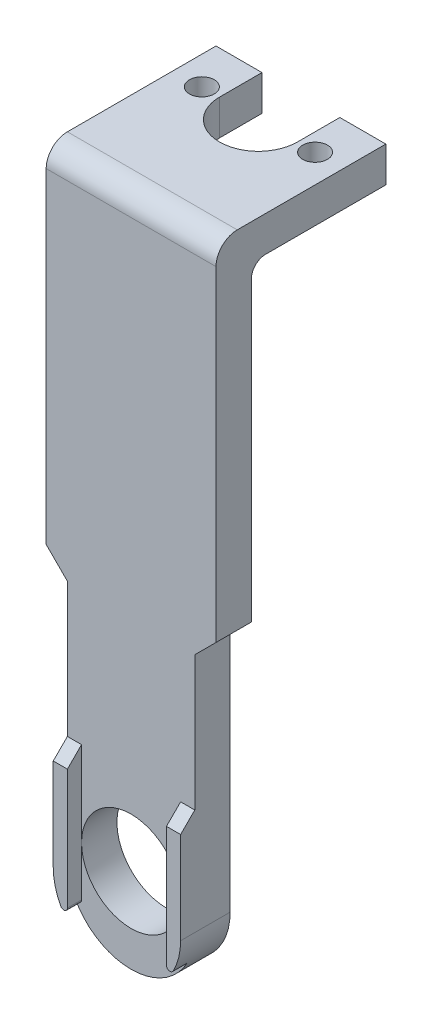
ISO-10303-21;
HEADER;
FILE_DESCRIPTION(('STEP AP214'),'2;1');
FILE_NAME('part.step','',(''),(''),'','','');
FILE_SCHEMA(('AUTOMOTIVE_DESIGN { 1 0 10303 214 1 1 1 1 }'));
ENDSEC;
DATA;
#1=APPLICATION_CONTEXT('core data for automotive mechanical design processes');
#2=APPLICATION_PROTOCOL_DEFINITION('international standard','automotive_design',2000,#1);
#3=PRODUCT_CONTEXT('',#1,'mechanical');
#4=PRODUCT('Part','Part','',(#3));
#5=PRODUCT_RELATED_PRODUCT_CATEGORY('part','',(#4));
#6=PRODUCT_DEFINITION_FORMATION('','',#4);
#7=PRODUCT_DEFINITION_CONTEXT('part definition',#1,'design');
#8=PRODUCT_DEFINITION('design','',#6,#7);
#9=PRODUCT_DEFINITION_SHAPE('','',#8);
#10=(LENGTH_UNIT() NAMED_UNIT(*) SI_UNIT(.MILLI.,.METRE.));
#11=(NAMED_UNIT(*) PLANE_ANGLE_UNIT() SI_UNIT($,.RADIAN.));
#12=(NAMED_UNIT(*) SI_UNIT($,.STERADIAN.) SOLID_ANGLE_UNIT());
#13=UNCERTAINTY_MEASURE_WITH_UNIT(LENGTH_MEASURE(1.E-05),#10,'distance_accuracy_value','');
#14=(GEOMETRIC_REPRESENTATION_CONTEXT(3) GLOBAL_UNCERTAINTY_ASSIGNED_CONTEXT((#13)) GLOBAL_UNIT_ASSIGNED_CONTEXT((#10,
#11,#12)) REPRESENTATION_CONTEXT('',''));
#15=CARTESIAN_POINT('',(0.,0.,0.));
#16=DIRECTION('',(0.,0.,1.));
#17=DIRECTION('',(1.,0.,0.));
#18=AXIS2_PLACEMENT_3D('',#15,#16,#17);
#19=CARTESIAN_POINT('',(-12.,5.,18.));
#20=DIRECTION('',(0.,0.,-1.));
#21=DIRECTION('',(-1.,0.,0.));
#22=AXIS2_PLACEMENT_3D('',#19,#20,#21);
#23=PLANE('',#22);
#24=DIRECTION('',(0.,-1.,0.));
#25=VECTOR('',#24,1.);
#26=CARTESIAN_POINT('',(7.,-68.,18.));
#27=LINE('',#26,#25);
#28=CARTESIAN_POINT('',(7.00000000000001,-78.,18.));
#29=VERTEX_POINT('',#28);
#30=CARTESIAN_POINT('',(7.,-85.,18.));
#31=VERTEX_POINT('',#30);
#32=EDGE_CURVE('E257',#29,#31,#27,.T.);
#33=ORIENTED_EDGE('',*,*,#32,.F.);
#34=CARTESIAN_POINT('',(0.,-78.,18.));
#35=DIRECTION('',(0.,0.,1.));
#36=DIRECTION('',(1.,0.,0.));
#37=AXIS2_PLACEMENT_3D('',#34,#35,#36);
#38=CIRCLE('',#37,7.);
#39=CARTESIAN_POINT('',(-6.99999999999999,-78.,18.));
#40=VERTEX_POINT('',#39);
#41=EDGE_CURVE('E346',#40,#29,#38,.T.);
#42=ORIENTED_EDGE('',*,*,#41,.F.);
#43=DIRECTION('',(0.,1.,0.));
#44=VECTOR('',#43,1.);
#45=CARTESIAN_POINT('',(-7.,-68.,18.));
#46=LINE('',#45,#44);
#47=CARTESIAN_POINT('',(-6.99999999999999,-85.,18.));
#48=VERTEX_POINT('',#47);
#49=EDGE_CURVE('E263',#48,#40,#46,.T.);
#50=ORIENTED_EDGE('',*,*,#49,.F.);
#51=CARTESIAN_POINT('',(-7.5,-85.,18.));
#52=DIRECTION('',(0.,0.,-1.));
#53=DIRECTION('',(-1.,0.,0.));
#54=AXIS2_PLACEMENT_3D('',#51,#52,#53);
#55=CIRCLE('',#54,0.5);
#56=CARTESIAN_POINT('',(-7.94117647058824,-85.235294117647,18.));
#57=VERTEX_POINT('',#56);
#58=EDGE_CURVE('E11',#48,#57,#55,.T.);
#59=ORIENTED_EDGE('',*,*,#58,.T.);
#60=CARTESIAN_POINT('',(0.,-81.,18.));
#61=DIRECTION('',(0.,0.,-1.));
#62=DIRECTION('',(-1.,0.,0.));
#63=AXIS2_PLACEMENT_3D('',#60,#61,#62);
#64=CIRCLE('',#63,9.);
#65=CARTESIAN_POINT('',(0.,-90.,18.));
#66=VERTEX_POINT('',#65);
#67=EDGE_CURVE('E57',#57,#66,#64,.F.);
#68=ORIENTED_EDGE('',*,*,#67,.T.);
#69=CARTESIAN_POINT('',(0.,-81.,18.));
#70=DIRECTION('',(0.,0.,-1.));
#71=DIRECTION('',(-1.,0.,0.));
#72=AXIS2_PLACEMENT_3D('',#69,#70,#71);
#73=CIRCLE('',#72,9.);
#74=CARTESIAN_POINT('',(7.94117647058824,-85.2352941176471,18.));
#75=VERTEX_POINT('',#74);
#76=EDGE_CURVE('E456',#66,#75,#73,.F.);
#77=ORIENTED_EDGE('',*,*,#76,.T.);
#78=CARTESIAN_POINT('',(7.5,-85.,18.));
#79=DIRECTION('',(0.,0.,-1.));
#80=DIRECTION('',(-1.,0.,0.));
#81=AXIS2_PLACEMENT_3D('',#78,#79,#80);
#82=CIRCLE('',#81,0.5);
#83=EDGE_CURVE('E50',#75,#31,#82,.T.);
#84=ORIENTED_EDGE('',*,*,#83,.T.);
#85=EDGE_LOOP('',(#33,#42,#50,#59,#68,#77,#84));
#86=FACE_BOUND('',#85,.T.);
#87=ADVANCED_FACE('F41',(#86),#23,.F.);
#88=CARTESIAN_POINT('',(7.,-66.,18.));
#89=VERTEX_POINT('',#88);
#90=EDGE_CURVE('E253',#89,#29,#27,.T.);
#91=ORIENTED_EDGE('',*,*,#90,.F.);
#92=DIRECTION('',(1.,0.,0.));
#93=VECTOR('',#92,1.);
#94=CARTESIAN_POINT('',(9.00000000000001,-66.,18.));
#95=LINE('',#94,#93);
#96=CARTESIAN_POINT('',(9.00000000000001,-66.,18.));
#97=VERTEX_POINT('',#96);
#98=EDGE_CURVE('E468',#89,#97,#95,.T.);
#99=ORIENTED_EDGE('',*,*,#98,.T.);
#100=DIRECTION('',(0.,-1.,0.));
#101=VECTOR('',#100,1.);
#102=CARTESIAN_POINT('',(9.00000000000001,-47.,18.));
#103=LINE('',#102,#101);
#104=CARTESIAN_POINT('',(9.00000000000001,-47.,18.));
#105=VERTEX_POINT('',#104);
#106=EDGE_CURVE('E292',#105,#97,#103,.T.);
#107=ORIENTED_EDGE('',*,*,#106,.F.);
#108=DIRECTION('',(-0.707106781186544,-0.707106781186551,0.));
#109=VECTOR('',#108,1.);
#110=CARTESIAN_POINT('',(12.,-44.,18.));
#111=LINE('',#110,#109);
#112=CARTESIAN_POINT('',(12.,-44.,18.));
#113=VERTEX_POINT('',#112);
#114=EDGE_CURVE('E295',#113,#105,#111,.T.);
#115=ORIENTED_EDGE('',*,*,#114,.F.);
#116=DIRECTION('',(0.,-1.,0.));
#117=VECTOR('',#116,1.);
#118=CARTESIAN_POINT('',(12.,5.,18.));
#119=LINE('',#118,#117);
#120=CARTESIAN_POINT('',(12.,2.,18.));
#121=VERTEX_POINT('',#120);
#122=EDGE_CURVE('E390',#121,#113,#119,.T.);
#123=ORIENTED_EDGE('',*,*,#122,.F.);
#124=DIRECTION('',(1.,0.,0.));
#125=VECTOR('',#124,1.);
#126=CARTESIAN_POINT('',(-12.,2.,18.));
#127=LINE('',#126,#125);
#128=CARTESIAN_POINT('',(-12.,2.,18.));
#129=VERTEX_POINT('',#128);
#130=EDGE_CURVE('E410',#121,#129,#127,.F.);
#131=ORIENTED_EDGE('',*,*,#130,.T.);
#132=DIRECTION('',(0.,-1.,0.));
#133=VECTOR('',#132,1.);
#134=CARTESIAN_POINT('',(-12.,5.,18.));
#135=LINE('',#134,#133);
#136=CARTESIAN_POINT('',(-12.,-44.,18.));
#137=VERTEX_POINT('',#136);
#138=EDGE_CURVE('E399',#129,#137,#135,.T.);
#139=ORIENTED_EDGE('',*,*,#138,.T.);
#140=DIRECTION('',(-0.707106781186544,0.707106781186551,0.));
#141=VECTOR('',#140,1.);
#142=CARTESIAN_POINT('',(-12.,-44.,18.));
#143=LINE('',#142,#141);
#144=CARTESIAN_POINT('',(-9.,-47.,18.));
#145=VERTEX_POINT('',#144);
#146=EDGE_CURVE('E279',#145,#137,#143,.T.);
#147=ORIENTED_EDGE('',*,*,#146,.F.);
#148=DIRECTION('',(0.,1.,0.));
#149=VECTOR('',#148,1.);
#150=CARTESIAN_POINT('',(-9.,-47.,18.));
#151=LINE('',#150,#149);
#152=CARTESIAN_POINT('',(-9.,-66.,18.));
#153=VERTEX_POINT('',#152);
#154=EDGE_CURVE('E276',#153,#145,#151,.T.);
#155=ORIENTED_EDGE('',*,*,#154,.F.);
#156=DIRECTION('',(1.,0.,0.));
#157=VECTOR('',#156,1.);
#158=CARTESIAN_POINT('',(-7.,-66.,18.));
#159=LINE('',#158,#157);
#160=CARTESIAN_POINT('',(-7.,-66.,18.));
#161=VERTEX_POINT('',#160);
#162=EDGE_CURVE('E462',#153,#161,#159,.T.);
#163=ORIENTED_EDGE('',*,*,#162,.T.);
#164=EDGE_CURVE('E249',#40,#161,#46,.T.);
#165=ORIENTED_EDGE('',*,*,#164,.F.);
#166=EDGE_CURVE('E345',#29,#40,#38,.T.);
#167=ORIENTED_EDGE('',*,*,#166,.F.);
#168=EDGE_LOOP('',(#91,#99,#107,#115,#123,#131,#139,#147,#155,#163,#165,#167));
#169=FACE_BOUND('',#168,.T.);
#170=ADVANCED_FACE('F530',(#169),#23,.F.);
#171=CARTESIAN_POINT('',(12.,-90.,-6.));
#172=DIRECTION('',(0.,0.,1.));
#173=DIRECTION('',(1.,0.,0.));
#174=AXIS2_PLACEMENT_3D('',#171,#172,#173);
#175=PLANE('',#174);
#176=DIRECTION('',(1.,0.,0.));
#177=VECTOR('',#176,1.);
#178=CARTESIAN_POINT('',(12.,5.,-6.));
#179=LINE('',#178,#177);
#180=CARTESIAN_POINT('',(-12.,5.,-6.));
#181=VERTEX_POINT('',#180);
#182=CARTESIAN_POINT('',(-5.5,5.,-6.));
#183=VERTEX_POINT('',#182);
#184=EDGE_CURVE('E329',#181,#183,#179,.T.);
#185=ORIENTED_EDGE('',*,*,#184,.T.);
#186=DIRECTION('',(0.,-1.,0.));
#187=VECTOR('',#186,1.);
#188=CARTESIAN_POINT('',(-5.5,-90.,-6.));
#189=LINE('',#188,#187);
#190=CARTESIAN_POINT('',(-5.5,0.,-6.));
#191=VERTEX_POINT('',#190);
#192=EDGE_CURVE('E439',#183,#191,#189,.T.);
#193=ORIENTED_EDGE('',*,*,#192,.T.);
#194=DIRECTION('',(-1.,0.,0.));
#195=VECTOR('',#194,1.);
#196=CARTESIAN_POINT('',(0.,0.,-6.));
#197=LINE('',#196,#195);
#198=CARTESIAN_POINT('',(-12.,0.,-6.));
#199=VERTEX_POINT('',#198);
#200=EDGE_CURVE('E338',#191,#199,#197,.T.);
#201=ORIENTED_EDGE('',*,*,#200,.T.);
#202=DIRECTION('',(0.,1.,0.));
#203=VECTOR('',#202,1.);
#204=CARTESIAN_POINT('',(-12.,-90.,-6.));
#205=LINE('',#204,#203);
#206=EDGE_CURVE('E333',#199,#181,#205,.T.);
#207=ORIENTED_EDGE('',*,*,#206,.T.);
#208=EDGE_LOOP('',(#185,#193,#201,#207));
#209=FACE_BOUND('',#208,.T.);
#210=ADVANCED_FACE('F595',(#209),#175,.F.);
#211=CARTESIAN_POINT('',(0.,5.,0.));
#212=DIRECTION('',(0.,-1.,0.));
#213=DIRECTION('',(0.,0.,-1.));
#214=AXIS2_PLACEMENT_3D('',#211,#212,#213);
#215=PLANE('',#214);
#216=CARTESIAN_POINT('',(0.,5.,0.));
#217=DIRECTION('',(0.,1.,0.));
#218=DIRECTION('',(0.,0.,1.));
#219=AXIS2_PLACEMENT_3D('',#216,#217,#218);
#220=CIRCLE('',#219,5.5);
#221=CARTESIAN_POINT('',(-5.5,5.,0.));
#222=VERTEX_POINT('',#221);
#223=CARTESIAN_POINT('',(5.5,5.,0.));
#224=VERTEX_POINT('',#223);
#225=EDGE_CURVE('E374',#222,#224,#220,.T.);
#226=ORIENTED_EDGE('',*,*,#225,.F.);
#227=DIRECTION('',(0.,0.,1.));
#228=VECTOR('',#227,1.);
#229=CARTESIAN_POINT('',(-5.5,5.,-6.));
#230=LINE('',#229,#228);
#231=EDGE_CURVE('E309',#183,#222,#230,.T.);
#232=ORIENTED_EDGE('',*,*,#231,.F.);
#233=ORIENTED_EDGE('',*,*,#184,.F.);
#234=DIRECTION('',(0.,0.,1.));
#235=VECTOR('',#234,1.);
#236=CARTESIAN_POINT('',(-12.,5.,-8.));
#237=LINE('',#236,#235);
#238=CARTESIAN_POINT('',(-12.,5.,15.));
#239=VERTEX_POINT('',#238);
#240=EDGE_CURVE('E382',#181,#239,#237,.T.);
#241=ORIENTED_EDGE('',*,*,#240,.T.);
#242=DIRECTION('',(1.,0.,0.));
#243=VECTOR('',#242,1.);
#244=CARTESIAN_POINT('',(0.,5.,15.));
#245=LINE('',#244,#243);
#246=CARTESIAN_POINT('',(12.,5.,15.));
#247=VERTEX_POINT('',#246);
#248=EDGE_CURVE('E403',#239,#247,#245,.T.);
#249=ORIENTED_EDGE('',*,*,#248,.T.);
#250=DIRECTION('',(0.,0.,-1.));
#251=VECTOR('',#250,1.);
#252=CARTESIAN_POINT('',(12.,5.,18.));
#253=LINE('',#252,#251);
#254=CARTESIAN_POINT('',(12.,5.,-5.99999999999999));
#255=VERTEX_POINT('',#254);
#256=EDGE_CURVE('E385',#247,#255,#253,.T.);
#257=ORIENTED_EDGE('',*,*,#256,.T.);
#258=CARTESIAN_POINT('',(5.5,5.,-6.));
#259=VERTEX_POINT('',#258);
#260=EDGE_CURVE('E328',#259,#255,#179,.T.);
#261=ORIENTED_EDGE('',*,*,#260,.F.);
#262=DIRECTION('',(0.,0.,-1.));
#263=VECTOR('',#262,1.);
#264=CARTESIAN_POINT('',(5.5,5.,0.));
#265=LINE('',#264,#263);
#266=EDGE_CURVE('E312',#224,#259,#265,.T.);
#267=ORIENTED_EDGE('',*,*,#266,.F.);
#268=EDGE_LOOP('',(#226,#232,#233,#241,#249,#257,#261,#267));
#269=FACE_BOUND('',#268,.T.);
#270=CARTESIAN_POINT('',(-8.,5.,0.));
#271=DIRECTION('',(0.,1.,0.));
#272=DIRECTION('',(0.,0.,1.));
#273=AXIS2_PLACEMENT_3D('',#270,#271,#272);
#274=CIRCLE('',#273,1.75);
#275=CARTESIAN_POINT('',(-8.,5.,1.75));
#276=VERTEX_POINT('',#275);
#277=EDGE_CURVE('E366',#276,#276,#274,.T.);
#278=ORIENTED_EDGE('',*,*,#277,.F.);
#279=EDGE_LOOP('',(#278));
#280=FACE_BOUND('',#279,.T.);
#281=CARTESIAN_POINT('',(8.,5.,0.));
#282=DIRECTION('',(0.,1.,0.));
#283=DIRECTION('',(0.,0.,1.));
#284=AXIS2_PLACEMENT_3D('',#281,#282,#283);
#285=CIRCLE('',#284,1.75);
#286=CARTESIAN_POINT('',(8.,5.,1.75));
#287=VERTEX_POINT('',#286);
#288=EDGE_CURVE('E358',#287,#287,#285,.T.);
#289=ORIENTED_EDGE('',*,*,#288,.F.);
#290=EDGE_LOOP('',(#289));
#291=FACE_BOUND('',#290,.T.);
#292=ADVANCED_FACE('F546',(#269,#280,#291),#215,.F.);
#293=CARTESIAN_POINT('',(0.,0.,0.));
#294=DIRECTION('',(0.,-1.,0.));
#295=DIRECTION('',(0.,0.,-1.));
#296=AXIS2_PLACEMENT_3D('',#293,#294,#295);
#297=PLANE('',#296);
#298=DIRECTION('',(0.,0.,-1.));
#299=VECTOR('',#298,1.);
#300=CARTESIAN_POINT('',(-5.5,0.,0.));
#301=LINE('',#300,#299);
#302=CARTESIAN_POINT('',(-5.5,0.,0.));
#303=VERTEX_POINT('',#302);
#304=EDGE_CURVE('E325',#303,#191,#301,.T.);
#305=ORIENTED_EDGE('',*,*,#304,.F.);
#306=CARTESIAN_POINT('',(0.,0.,0.));
#307=DIRECTION('',(0.,1.,0.));
#308=DIRECTION('',(0.,0.,1.));
#309=AXIS2_PLACEMENT_3D('',#306,#307,#308);
#310=CIRCLE('',#309,5.5);
#311=CARTESIAN_POINT('',(5.5,0.,0.));
#312=VERTEX_POINT('',#311);
#313=EDGE_CURVE('E370',#303,#312,#310,.T.);
#314=ORIENTED_EDGE('',*,*,#313,.T.);
#315=DIRECTION('',(0.,0.,1.));
#316=VECTOR('',#315,1.);
#317=CARTESIAN_POINT('',(5.5,0.,0.));
#318=LINE('',#317,#316);
#319=CARTESIAN_POINT('',(5.5,0.,-6.));
#320=VERTEX_POINT('',#319);
#321=EDGE_CURVE('E319',#320,#312,#318,.T.);
#322=ORIENTED_EDGE('',*,*,#321,.F.);
#323=CARTESIAN_POINT('',(12.,0.,-6.));
#324=VERTEX_POINT('',#323);
#325=EDGE_CURVE('E341',#324,#320,#197,.T.);
#326=ORIENTED_EDGE('',*,*,#325,.F.);
#327=DIRECTION('',(0.,0.,-1.));
#328=VECTOR('',#327,1.);
#329=CARTESIAN_POINT('',(12.,0.,-8.));
#330=LINE('',#329,#328);
#331=CARTESIAN_POINT('',(12.,0.,11.));
#332=VERTEX_POINT('',#331);
#333=EDGE_CURVE('E386',#332,#324,#330,.T.);
#334=ORIENTED_EDGE('',*,*,#333,.F.);
#335=DIRECTION('',(1.,0.,0.));
#336=VECTOR('',#335,1.);
#337=CARTESIAN_POINT('',(0.,0.,11.));
#338=LINE('',#337,#336);
#339=CARTESIAN_POINT('',(-12.,0.,11.));
#340=VERTEX_POINT('',#339);
#341=EDGE_CURVE('E421',#332,#340,#338,.F.);
#342=ORIENTED_EDGE('',*,*,#341,.T.);
#343=DIRECTION('',(0.,0.,1.));
#344=VECTOR('',#343,1.);
#345=CARTESIAN_POINT('',(-12.,0.,-8.));
#346=LINE('',#345,#344);
#347=EDGE_CURVE('E378',#199,#340,#346,.T.);
#348=ORIENTED_EDGE('',*,*,#347,.F.);
#349=ORIENTED_EDGE('',*,*,#200,.F.);
#350=EDGE_LOOP('',(#305,#314,#322,#326,#334,#342,#348,#349));
#351=FACE_BOUND('',#350,.T.);
#352=CARTESIAN_POINT('',(-8.,0.,0.));
#353=DIRECTION('',(0.,1.,0.));
#354=DIRECTION('',(0.,0.,1.));
#355=AXIS2_PLACEMENT_3D('',#352,#353,#354);
#356=CIRCLE('',#355,1.75);
#357=CARTESIAN_POINT('',(-8.,0.,1.75));
#358=VERTEX_POINT('',#357);
#359=EDGE_CURVE('E362',#358,#358,#356,.T.);
#360=ORIENTED_EDGE('',*,*,#359,.T.);
#361=EDGE_LOOP('',(#360));
#362=FACE_BOUND('',#361,.T.);
#363=CARTESIAN_POINT('',(8.,0.,0.));
#364=DIRECTION('',(0.,1.,0.));
#365=DIRECTION('',(0.,0.,1.));
#366=AXIS2_PLACEMENT_3D('',#363,#364,#365);
#367=CIRCLE('',#366,1.75);
#368=CARTESIAN_POINT('',(8.,0.,1.75));
#369=VERTEX_POINT('',#368);
#370=EDGE_CURVE('E357',#369,#369,#367,.T.);
#371=ORIENTED_EDGE('',*,*,#370,.T.);
#372=EDGE_LOOP('',(#371));
#373=FACE_BOUND('',#372,.T.);
#374=ADVANCED_FACE('F559',(#351,#362,#373),#297,.T.);
#375=CARTESIAN_POINT('',(-12.,5.,-8.));
#376=DIRECTION('',(1.,0.,0.));
#377=DIRECTION('',(0.,0.,-1.));
#378=AXIS2_PLACEMENT_3D('',#375,#376,#377);
#379=PLANE('',#378);
#380=DIRECTION('',(0.,1.,0.));
#381=VECTOR('',#380,1.);
#382=CARTESIAN_POINT('',(-12.,-90.,13.));
#383=LINE('',#382,#381);
#384=CARTESIAN_POINT('',(-12.,-44.,13.));
#385=VERTEX_POINT('',#384);
#386=CARTESIAN_POINT('',(-12.,-2.00000000000003,13.));
#387=VERTEX_POINT('',#386);
#388=EDGE_CURVE('E354',#385,#387,#383,.T.);
#389=ORIENTED_EDGE('',*,*,#388,.F.);
#390=DIRECTION('',(0.,0.,1.));
#391=VECTOR('',#390,1.);
#392=CARTESIAN_POINT('',(-12.,-44.,-6.));
#393=LINE('',#392,#391);
#394=EDGE_CURVE('E284',#385,#137,#393,.T.);
#395=ORIENTED_EDGE('',*,*,#394,.T.);
#396=ORIENTED_EDGE('',*,*,#138,.F.);
#397=CARTESIAN_POINT('',(-12.,2.,15.));
#398=DIRECTION('',(1.,0.,0.));
#399=DIRECTION('',(0.,0.,-1.));
#400=AXIS2_PLACEMENT_3D('',#397,#398,#399);
#401=CIRCLE('',#400,3.);
#402=EDGE_CURVE('E413',#129,#239,#401,.F.);
#403=ORIENTED_EDGE('',*,*,#402,.T.);
#404=ORIENTED_EDGE('',*,*,#240,.F.);
#405=ORIENTED_EDGE('',*,*,#206,.F.);
#406=ORIENTED_EDGE('',*,*,#347,.T.);
#407=CARTESIAN_POINT('',(-12.,-2.,11.));
#408=DIRECTION('',(1.,0.,0.));
#409=DIRECTION('',(0.,0.,-1.));
#410=AXIS2_PLACEMENT_3D('',#407,#408,#409);
#411=CIRCLE('',#410,2.);
#412=EDGE_CURVE('E428',#340,#387,#411,.T.);
#413=ORIENTED_EDGE('',*,*,#412,.T.);
#414=EDGE_LOOP('',(#389,#395,#396,#403,#404,#405,#406,#413));
#415=FACE_BOUND('',#414,.T.);
#416=ADVANCED_FACE('F538',(#415),#379,.F.);
#417=CARTESIAN_POINT('',(12.,5.,-8.));
#418=DIRECTION('',(-1.,0.,0.));
#419=DIRECTION('',(0.,0.,1.));
#420=AXIS2_PLACEMENT_3D('',#417,#418,#419);
#421=PLANE('',#420);
#422=ORIENTED_EDGE('',*,*,#122,.T.);
#423=DIRECTION('',(0.,0.,1.));
#424=VECTOR('',#423,1.);
#425=CARTESIAN_POINT('',(12.,-44.,-6.));
#426=LINE('',#425,#424);
#427=CARTESIAN_POINT('',(12.,-44.,13.));
#428=VERTEX_POINT('',#427);
#429=EDGE_CURVE('E299',#428,#113,#426,.T.);
#430=ORIENTED_EDGE('',*,*,#429,.F.);
#431=DIRECTION('',(0.,1.,0.));
#432=VECTOR('',#431,1.);
#433=CARTESIAN_POINT('',(12.,-90.,13.));
#434=LINE('',#433,#432);
#435=CARTESIAN_POINT('',(12.,-2.00000000000003,13.));
#436=VERTEX_POINT('',#435);
#437=EDGE_CURVE('E351',#428,#436,#434,.T.);
#438=ORIENTED_EDGE('',*,*,#437,.T.);
#439=CARTESIAN_POINT('',(12.,-2.,11.));
#440=DIRECTION('',(-1.,0.,0.));
#441=DIRECTION('',(0.,0.,1.));
#442=AXIS2_PLACEMENT_3D('',#439,#440,#441);
#443=CIRCLE('',#442,2.);
#444=EDGE_CURVE('E425',#436,#332,#443,.T.);
#445=ORIENTED_EDGE('',*,*,#444,.T.);
#446=ORIENTED_EDGE('',*,*,#333,.T.);
#447=DIRECTION('',(0.,1.,0.));
#448=VECTOR('',#447,1.);
#449=CARTESIAN_POINT('',(12.,-90.,-6.));
#450=LINE('',#449,#448);
#451=EDGE_CURVE('E334',#324,#255,#450,.T.);
#452=ORIENTED_EDGE('',*,*,#451,.T.);
#453=ORIENTED_EDGE('',*,*,#256,.F.);
#454=CARTESIAN_POINT('',(12.,2.,15.));
#455=DIRECTION('',(-1.,0.,0.));
#456=DIRECTION('',(0.,0.,1.));
#457=AXIS2_PLACEMENT_3D('',#454,#455,#456);
#458=CIRCLE('',#457,3.);
#459=EDGE_CURVE('E407',#247,#121,#458,.F.);
#460=ORIENTED_EDGE('',*,*,#459,.T.);
#461=EDGE_LOOP('',(#422,#430,#438,#445,#446,#452,#453,#460));
#462=FACE_BOUND('',#461,.T.);
#463=ADVANCED_FACE('F551',(#462),#421,.F.);
#464=CARTESIAN_POINT('',(0.,5.,0.));
#465=DIRECTION('',(0.,-1.,0.));
#466=DIRECTION('',(0.,0.,-1.));
#467=AXIS2_PLACEMENT_3D('',#464,#465,#466);
#468=CYLINDRICAL_SURFACE('',#467,5.5);
#469=DIRECTION('',(0.,1.,0.));
#470=VECTOR('',#469,1.);
#471=CARTESIAN_POINT('',(-5.5,-90.,0.));
#472=LINE('',#471,#470);
#473=EDGE_CURVE('E315',#303,#222,#472,.T.);
#474=ORIENTED_EDGE('',*,*,#473,.T.);
#475=ORIENTED_EDGE('',*,*,#225,.T.);
#476=DIRECTION('',(0.,1.,0.));
#477=VECTOR('',#476,1.);
#478=CARTESIAN_POINT('',(5.5,-90.,0.));
#479=LINE('',#478,#477);
#480=EDGE_CURVE('E316',#312,#224,#479,.T.);
#481=ORIENTED_EDGE('',*,*,#480,.F.);
#482=ORIENTED_EDGE('',*,*,#313,.F.);
#483=EDGE_LOOP('',(#474,#475,#481,#482));
#484=FACE_BOUND('',#483,.T.);
#485=ADVANCED_FACE('F568',(#484),#468,.F.);
#486=CARTESIAN_POINT('',(-8.,5.,0.));
#487=DIRECTION('',(0.,-1.,0.));
#488=DIRECTION('',(0.,0.,-1.));
#489=AXIS2_PLACEMENT_3D('',#486,#487,#488);
#490=CYLINDRICAL_SURFACE('',#489,1.75);
#491=ORIENTED_EDGE('',*,*,#277,.T.);
#492=EDGE_LOOP('',(#491));
#493=FACE_BOUND('',#492,.T.);
#494=ORIENTED_EDGE('',*,*,#359,.F.);
#495=EDGE_LOOP('',(#494));
#496=FACE_BOUND('',#495,.T.);
#497=ADVANCED_FACE('F669',(#493,#496),#490,.F.);
#498=CARTESIAN_POINT('',(8.,5.,0.));
#499=DIRECTION('',(0.,-1.,0.));
#500=DIRECTION('',(0.,0.,-1.));
#501=AXIS2_PLACEMENT_3D('',#498,#499,#500);
#502=CYLINDRICAL_SURFACE('',#501,1.75);
#503=ORIENTED_EDGE('',*,*,#288,.T.);
#504=EDGE_LOOP('',(#503));
#505=FACE_BOUND('',#504,.T.);
#506=ORIENTED_EDGE('',*,*,#370,.F.);
#507=EDGE_LOOP('',(#506));
#508=FACE_BOUND('',#507,.T.);
#509=ADVANCED_FACE('F665',(#505,#508),#502,.F.);
#510=CARTESIAN_POINT('',(-12.,-90.,13.));
#511=DIRECTION('',(0.,0.,1.));
#512=DIRECTION('',(1.,0.,0.));
#513=AXIS2_PLACEMENT_3D('',#510,#511,#512);
#514=PLANE('',#513);
#515=CARTESIAN_POINT('',(0.,-78.,13.));
#516=DIRECTION('',(0.,0.,1.));
#517=DIRECTION('',(1.,0.,0.));
#518=AXIS2_PLACEMENT_3D('',#515,#516,#517);
#519=CIRCLE('',#518,7.);
#520=CARTESIAN_POINT('',(7.00000000000001,-78.,13.));
#521=VERTEX_POINT('',#520);
#522=EDGE_CURVE('E350',#521,#521,#519,.T.);
#523=ORIENTED_EDGE('',*,*,#522,.T.);
#524=EDGE_LOOP('',(#523));
#525=FACE_BOUND('',#524,.T.);
#526=DIRECTION('',(0.,-1.,0.));
#527=VECTOR('',#526,1.);
#528=CARTESIAN_POINT('',(9.00000000000001,-90.,13.));
#529=LINE('',#528,#527);
#530=CARTESIAN_POINT('',(9.00000000000001,-47.,13.));
#531=VERTEX_POINT('',#530);
#532=CARTESIAN_POINT('',(9.00000000000001,-81.,13.));
#533=VERTEX_POINT('',#532);
#534=EDGE_CURVE('E288',#531,#533,#529,.T.);
#535=ORIENTED_EDGE('',*,*,#534,.T.);
#536=CARTESIAN_POINT('',(0.,-81.,13.));
#537=DIRECTION('',(0.,0.,1.));
#538=DIRECTION('',(1.,0.,0.));
#539=AXIS2_PLACEMENT_3D('',#536,#537,#538);
#540=CIRCLE('',#539,9.);
#541=CARTESIAN_POINT('',(0.,-90.,13.));
#542=VERTEX_POINT('',#541);
#543=EDGE_CURVE('E234',#533,#542,#540,.F.);
#544=ORIENTED_EDGE('',*,*,#543,.T.);
#545=CARTESIAN_POINT('',(0.,-81.,13.));
#546=DIRECTION('',(0.,0.,1.));
#547=DIRECTION('',(1.,0.,0.));
#548=AXIS2_PLACEMENT_3D('',#545,#546,#547);
#549=CIRCLE('',#548,9.);
#550=CARTESIAN_POINT('',(-8.99999999999999,-81.,13.));
#551=VERTEX_POINT('',#550);
#552=EDGE_CURVE('E238',#542,#551,#549,.F.);
#553=ORIENTED_EDGE('',*,*,#552,.T.);
#554=DIRECTION('',(0.,1.,0.));
#555=VECTOR('',#554,1.);
#556=CARTESIAN_POINT('',(-8.99999999999999,-90.,13.));
#557=LINE('',#556,#555);
#558=CARTESIAN_POINT('',(-9.,-47.,13.));
#559=VERTEX_POINT('',#558);
#560=EDGE_CURVE('E306',#551,#559,#557,.T.);
#561=ORIENTED_EDGE('',*,*,#560,.T.);
#562=DIRECTION('',(-0.707106781186544,0.707106781186551,0.));
#563=VECTOR('',#562,1.);
#564=CARTESIAN_POINT('',(11.,-67.0000000000003,13.));
#565=LINE('',#564,#563);
#566=EDGE_CURVE('E239',#559,#385,#565,.T.);
#567=ORIENTED_EDGE('',*,*,#566,.T.);
#568=ORIENTED_EDGE('',*,*,#388,.T.);
#569=DIRECTION('',(1.,0.,0.));
#570=VECTOR('',#569,1.);
#571=CARTESIAN_POINT('',(-12.,-2.,13.));
#572=LINE('',#571,#570);
#573=EDGE_CURVE('E417',#387,#436,#572,.T.);
#574=ORIENTED_EDGE('',*,*,#573,.T.);
#575=ORIENTED_EDGE('',*,*,#437,.F.);
#576=DIRECTION('',(-0.707106781186544,-0.707106781186551,0.));
#577=VECTOR('',#576,1.);
#578=CARTESIAN_POINT('',(-22.9999999999999,-79.0000000000003,13.));
#579=LINE('',#578,#577);
#580=EDGE_CURVE('E443',#428,#531,#579,.T.);
#581=ORIENTED_EDGE('',*,*,#580,.T.);
#582=EDGE_LOOP('',(#535,#544,#553,#561,#567,#568,#574,#575,#581));
#583=FACE_BOUND('',#582,.T.);
#584=ADVANCED_FACE('F519',(#525,#583),#514,.F.);
#585=CARTESIAN_POINT('',(0.,2.,15.));
#586=DIRECTION('',(1.,0.,0.));
#587=DIRECTION('',(0.,0.,-1.));
#588=AXIS2_PLACEMENT_3D('',#585,#586,#587);
#589=CYLINDRICAL_SURFACE('',#588,3.);
#590=ORIENTED_EDGE('',*,*,#402,.F.);
#591=ORIENTED_EDGE('',*,*,#130,.F.);
#592=ORIENTED_EDGE('',*,*,#459,.F.);
#593=ORIENTED_EDGE('',*,*,#248,.F.);
#594=EDGE_LOOP('',(#590,#591,#592,#593));
#595=FACE_BOUND('',#594,.T.);
#596=ADVANCED_FACE('F542',(#595),#589,.T.);
#597=CARTESIAN_POINT('',(-12.,-2.,11.));
#598=DIRECTION('',(1.,0.,0.));
#599=DIRECTION('',(0.,0.,-1.));
#600=AXIS2_PLACEMENT_3D('',#597,#598,#599);
#601=CYLINDRICAL_SURFACE('',#600,2.);
#602=ORIENTED_EDGE('',*,*,#412,.F.);
#603=ORIENTED_EDGE('',*,*,#341,.F.);
#604=ORIENTED_EDGE('',*,*,#444,.F.);
#605=ORIENTED_EDGE('',*,*,#573,.F.);
#606=EDGE_LOOP('',(#602,#603,#604,#605));
#607=FACE_BOUND('',#606,.T.);
#608=ADVANCED_FACE('F601',(#607),#601,.F.);
#609=CARTESIAN_POINT('',(0.,-78.,-42.));
#610=DIRECTION('',(0.,0.,1.));
#611=DIRECTION('',(1.,0.,0.));
#612=AXIS2_PLACEMENT_3D('',#609,#610,#611);
#613=CYLINDRICAL_SURFACE('',#612,7.);
#614=ORIENTED_EDGE('',*,*,#41,.T.);
#615=ORIENTED_EDGE('',*,*,#166,.T.);
#616=EDGE_LOOP('',(#614,#615));
#617=FACE_BOUND('',#616,.T.);
#618=ORIENTED_EDGE('',*,*,#522,.F.);
#619=EDGE_LOOP('',(#618));
#620=FACE_BOUND('',#619,.T.);
#621=ADVANCED_FACE('F588',(#617,#620),#613,.F.);
#622=ORIENTED_EDGE('',*,*,#325,.T.);
#623=DIRECTION('',(0.,1.,0.));
#624=VECTOR('',#623,1.);
#625=CARTESIAN_POINT('',(5.5,-90.,-6.));
#626=LINE('',#625,#624);
#627=EDGE_CURVE('E432',#320,#259,#626,.T.);
#628=ORIENTED_EDGE('',*,*,#627,.T.);
#629=ORIENTED_EDGE('',*,*,#260,.T.);
#630=ORIENTED_EDGE('',*,*,#451,.F.);
#631=EDGE_LOOP('',(#622,#628,#629,#630));
#632=FACE_BOUND('',#631,.T.);
#633=ADVANCED_FACE('F555',(#632),#175,.F.);
#634=CARTESIAN_POINT('',(5.5,-90.,0.));
#635=DIRECTION('',(1.,0.,0.));
#636=DIRECTION('',(0.,0.,-1.));
#637=AXIS2_PLACEMENT_3D('',#634,#635,#636);
#638=PLANE('',#637);
#639=ORIENTED_EDGE('',*,*,#321,.T.);
#640=ORIENTED_EDGE('',*,*,#480,.T.);
#641=ORIENTED_EDGE('',*,*,#266,.T.);
#642=ORIENTED_EDGE('',*,*,#627,.F.);
#643=EDGE_LOOP('',(#639,#640,#641,#642));
#644=FACE_BOUND('',#643,.T.);
#645=ADVANCED_FACE('F565',(#644),#638,.F.);
#646=CARTESIAN_POINT('',(-5.5,-90.,-6.));
#647=DIRECTION('',(-1.,0.,0.));
#648=DIRECTION('',(0.,0.,1.));
#649=AXIS2_PLACEMENT_3D('',#646,#647,#648);
#650=PLANE('',#649);
#651=ORIENTED_EDGE('',*,*,#304,.T.);
#652=ORIENTED_EDGE('',*,*,#192,.F.);
#653=ORIENTED_EDGE('',*,*,#231,.T.);
#654=ORIENTED_EDGE('',*,*,#473,.F.);
#655=EDGE_LOOP('',(#651,#652,#653,#654));
#656=FACE_BOUND('',#655,.T.);
#657=ADVANCED_FACE('F651',(#656),#650,.F.);
#658=CARTESIAN_POINT('',(12.,-44.,-6.));
#659=DIRECTION('',(-0.707106781186551,0.707106781186544,0.));
#660=DIRECTION('',(-0.707106781186544,-0.707106781186551,0.));
#661=AXIS2_PLACEMENT_3D('',#658,#659,#660);
#662=PLANE('',#661);
#663=ORIENTED_EDGE('',*,*,#429,.T.);
#664=ORIENTED_EDGE('',*,*,#114,.T.);
#665=DIRECTION('',(0.,0.,1.));
#666=VECTOR('',#665,1.);
#667=CARTESIAN_POINT('',(9.00000000000001,-47.,-6.));
#668=LINE('',#667,#666);
#669=EDGE_CURVE('E280',#531,#105,#668,.T.);
#670=ORIENTED_EDGE('',*,*,#669,.F.);
#671=ORIENTED_EDGE('',*,*,#580,.F.);
#672=EDGE_LOOP('',(#663,#664,#670,#671));
#673=FACE_BOUND('',#672,.T.);
#674=ADVANCED_FACE('F606',(#673),#662,.F.);
#675=CARTESIAN_POINT('',(9.00000000000001,-47.,-6.));
#676=DIRECTION('',(-1.,0.,0.));
#677=DIRECTION('',(0.,-1.,0.));
#678=AXIS2_PLACEMENT_3D('',#675,#676,#677);
#679=PLANE('',#678);
#680=ORIENTED_EDGE('',*,*,#106,.T.);
#681=DIRECTION('',(0.,0.707106781186548,-0.707106781186547));
#682=VECTOR('',#681,1.);
#683=CARTESIAN_POINT('',(9.00000000000001,-44.5,-3.49999999999996));
#684=LINE('',#683,#682);
#685=CARTESIAN_POINT('',(9.,-68.,20.));
#686=VERTEX_POINT('',#685);
#687=EDGE_CURVE('E244',#97,#686,#684,.F.);
#688=ORIENTED_EDGE('',*,*,#687,.T.);
#689=DIRECTION('',(0.,1.,0.));
#690=VECTOR('',#689,1.);
#691=CARTESIAN_POINT('',(9.,-68.,20.));
#692=LINE('',#691,#690);
#693=CARTESIAN_POINT('',(9.,-81.,20.));
#694=VERTEX_POINT('',#693);
#695=EDGE_CURVE('E220',#694,#686,#692,.T.);
#696=ORIENTED_EDGE('',*,*,#695,.F.);
#697=DIRECTION('',(0.,0.,-1.));
#698=VECTOR('',#697,1.);
#699=CARTESIAN_POINT('',(9.00000000000001,-81.,13.));
#700=LINE('',#699,#698);
#701=EDGE_CURVE('E231',#694,#533,#700,.T.);
#702=ORIENTED_EDGE('',*,*,#701,.T.);
#703=ORIENTED_EDGE('',*,*,#534,.F.);
#704=ORIENTED_EDGE('',*,*,#669,.T.);
#705=EDGE_LOOP('',(#680,#688,#696,#702,#703,#704));
#706=FACE_BOUND('',#705,.T.);
#707=ADVANCED_FACE('F242',(#706),#679,.F.);
#708=CARTESIAN_POINT('',(-12.,-44.,-6.));
#709=DIRECTION('',(0.707106781186551,0.707106781186544,0.));
#710=DIRECTION('',(-0.707106781186544,0.707106781186551,0.));
#711=AXIS2_PLACEMENT_3D('',#708,#709,#710);
#712=PLANE('',#711);
#713=DIRECTION('',(0.,0.,1.));
#714=VECTOR('',#713,1.);
#715=CARTESIAN_POINT('',(-9.,-47.,-6.));
#716=LINE('',#715,#714);
#717=EDGE_CURVE('E283',#559,#145,#716,.T.);
#718=ORIENTED_EDGE('',*,*,#717,.T.);
#719=ORIENTED_EDGE('',*,*,#146,.T.);
#720=ORIENTED_EDGE('',*,*,#394,.F.);
#721=ORIENTED_EDGE('',*,*,#566,.F.);
#722=EDGE_LOOP('',(#718,#719,#720,#721));
#723=FACE_BOUND('',#722,.T.);
#724=ADVANCED_FACE('F528',(#723),#712,.F.);
#725=CARTESIAN_POINT('',(-9.,-47.,-6.));
#726=DIRECTION('',(1.,0.,0.));
#727=DIRECTION('',(0.,1.,0.));
#728=AXIS2_PLACEMENT_3D('',#725,#726,#727);
#729=PLANE('',#728);
#730=ORIENTED_EDGE('',*,*,#560,.F.);
#731=DIRECTION('',(0.,0.,1.));
#732=VECTOR('',#731,1.);
#733=CARTESIAN_POINT('',(-8.99999999999999,-81.,18.));
#734=LINE('',#733,#732);
#735=CARTESIAN_POINT('',(-8.99999999999999,-81.,20.));
#736=VERTEX_POINT('',#735);
#737=EDGE_CURVE('E459',#551,#736,#734,.T.);
#738=ORIENTED_EDGE('',*,*,#737,.T.);
#739=DIRECTION('',(0.,-1.,0.));
#740=VECTOR('',#739,1.);
#741=CARTESIAN_POINT('',(-8.99999999999999,-68.,20.));
#742=LINE('',#741,#740);
#743=CARTESIAN_POINT('',(-8.99999999999999,-68.,20.));
#744=VERTEX_POINT('',#743);
#745=EDGE_CURVE('E262',#744,#736,#742,.T.);
#746=ORIENTED_EDGE('',*,*,#745,.F.);
#747=DIRECTION('',(0.,-0.707106781186548,0.707106781186547));
#748=VECTOR('',#747,1.);
#749=CARTESIAN_POINT('',(-9.,-44.5,-3.49999999999996));
#750=LINE('',#749,#748);
#751=EDGE_CURVE('E477',#744,#153,#750,.F.);
#752=ORIENTED_EDGE('',*,*,#751,.T.);
#753=ORIENTED_EDGE('',*,*,#154,.T.);
#754=ORIENTED_EDGE('',*,*,#717,.F.);
#755=EDGE_LOOP('',(#730,#738,#746,#752,#753,#754));
#756=FACE_BOUND('',#755,.T.);
#757=ADVANCED_FACE('F523',(#756),#729,.F.);
#758=CARTESIAN_POINT('',(0.,-81.,-6.));
#759=DIRECTION('',(0.,0.,-1.));
#760=DIRECTION('',(-1.,0.,0.));
#761=AXIS2_PLACEMENT_3D('',#758,#759,#760);
#762=CYLINDRICAL_SURFACE('',#761,9.);
#763=ORIENTED_EDGE('',*,*,#67,.F.);
#764=DIRECTION('',(0.,0.,-1.));
#765=VECTOR('',#764,1.);
#766=CARTESIAN_POINT('',(-7.94117647058823,-85.235294117647,-6.));
#767=LINE('',#766,#765);
#768=CARTESIAN_POINT('',(-7.94117647058823,-85.235294117647,20.));
#769=VERTEX_POINT('',#768);
#770=EDGE_CURVE('E61',#57,#769,#767,.F.);
#771=ORIENTED_EDGE('',*,*,#770,.T.);
#772=CARTESIAN_POINT('',(0.,-81.,20.));
#773=DIRECTION('',(0.,0.,1.));
#774=DIRECTION('',(1.,0.,0.));
#775=AXIS2_PLACEMENT_3D('',#772,#773,#774);
#776=CIRCLE('',#775,9.);
#777=EDGE_CURVE('E267',#736,#769,#776,.T.);
#778=ORIENTED_EDGE('',*,*,#777,.F.);
#779=ORIENTED_EDGE('',*,*,#737,.F.);
#780=ORIENTED_EDGE('',*,*,#552,.F.);
#781=DIRECTION('',(0.,0.,1.));
#782=VECTOR('',#781,1.);
#783=CARTESIAN_POINT('',(0.,-90.,13.));
#784=LINE('',#783,#782);
#785=EDGE_CURVE('E273',#66,#542,#784,.F.);
#786=ORIENTED_EDGE('',*,*,#785,.F.);
#787=EDGE_LOOP('',(#763,#771,#778,#779,#780,#786));
#788=FACE_BOUND('',#787,.T.);
#789=ADVANCED_FACE('F515',(#788),#762,.T.);
#790=CARTESIAN_POINT('',(0.,-81.,-6.));
#791=DIRECTION('',(0.,0.,1.));
#792=DIRECTION('',(1.,0.,0.));
#793=AXIS2_PLACEMENT_3D('',#790,#791,#792);
#794=CYLINDRICAL_SURFACE('',#793,9.);
#795=CARTESIAN_POINT('',(0.,-81.,20.));
#796=DIRECTION('',(0.,0.,1.));
#797=DIRECTION('',(-1.,0.,0.));
#798=AXIS2_PLACEMENT_3D('',#795,#796,#797);
#799=CIRCLE('',#798,8.99999999999999);
#800=CARTESIAN_POINT('',(7.94117647058823,-85.2352941176471,20.));
#801=VERTEX_POINT('',#800);
#802=EDGE_CURVE('E214',#801,#694,#799,.T.);
#803=ORIENTED_EDGE('',*,*,#802,.F.);
#804=DIRECTION('',(0.,0.,1.));
#805=VECTOR('',#804,1.);
#806=CARTESIAN_POINT('',(7.94117647058824,-85.2352941176471,-6.));
#807=LINE('',#806,#805);
#808=EDGE_CURVE('E484',#801,#75,#807,.F.);
#809=ORIENTED_EDGE('',*,*,#808,.T.);
#810=ORIENTED_EDGE('',*,*,#76,.F.);
#811=ORIENTED_EDGE('',*,*,#785,.T.);
#812=ORIENTED_EDGE('',*,*,#543,.F.);
#813=ORIENTED_EDGE('',*,*,#701,.F.);
#814=EDGE_LOOP('',(#803,#809,#810,#811,#812,#813));
#815=FACE_BOUND('',#814,.T.);
#816=ADVANCED_FACE('F232',(#815),#794,.T.);
#817=CARTESIAN_POINT('',(-7.,-68.,20.));
#818=DIRECTION('',(-1.,0.,0.));
#819=DIRECTION('',(0.,-1.,0.));
#820=AXIS2_PLACEMENT_3D('',#817,#818,#819);
#821=PLANE('',#820);
#822=DIRECTION('',(0.,1.,0.));
#823=VECTOR('',#822,1.);
#824=CARTESIAN_POINT('',(-7.,-68.,20.));
#825=LINE('',#824,#823);
#826=CARTESIAN_POINT('',(-6.99999999999999,-85.,20.));
#827=VERTEX_POINT('',#826);
#828=CARTESIAN_POINT('',(-7.,-68.,20.));
#829=VERTEX_POINT('',#828);
#830=EDGE_CURVE('E270',#827,#829,#825,.T.);
#831=ORIENTED_EDGE('',*,*,#830,.F.);
#832=DIRECTION('',(0.,0.,1.));
#833=VECTOR('',#832,1.);
#834=CARTESIAN_POINT('',(-6.99999999999999,-85.,18.));
#835=LINE('',#834,#833);
#836=EDGE_CURVE('E492',#827,#48,#835,.F.);
#837=ORIENTED_EDGE('',*,*,#836,.T.);
#838=ORIENTED_EDGE('',*,*,#49,.T.);
#839=ORIENTED_EDGE('',*,*,#164,.T.);
#840=DIRECTION('',(0.,0.707106781186548,-0.707106781186547));
#841=VECTOR('',#840,1.);
#842=CARTESIAN_POINT('',(-7.,-68.,20.));
#843=LINE('',#842,#841);
#844=EDGE_CURVE('E480',#161,#829,#843,.F.);
#845=ORIENTED_EDGE('',*,*,#844,.T.);
#846=EDGE_LOOP('',(#831,#837,#838,#839,#845));
#847=FACE_BOUND('',#846,.T.);
#848=ADVANCED_FACE('F575',(#847),#821,.F.);
#849=CARTESIAN_POINT('',(0.,-81.,20.));
#850=DIRECTION('',(0.,0.,1.));
#851=DIRECTION('',(1.,0.,0.));
#852=AXIS2_PLACEMENT_3D('',#849,#850,#851);
#853=PLANE('',#852);
#854=ORIENTED_EDGE('',*,*,#777,.T.);
#855=CARTESIAN_POINT('',(-7.5,-85.,20.));
#856=DIRECTION('',(0.,0.,1.));
#857=DIRECTION('',(1.,0.,0.));
#858=AXIS2_PLACEMENT_3D('',#855,#856,#857);
#859=CIRCLE('',#858,0.5);
#860=EDGE_CURVE('E498',#769,#827,#859,.T.);
#861=ORIENTED_EDGE('',*,*,#860,.T.);
#862=ORIENTED_EDGE('',*,*,#830,.T.);
#863=DIRECTION('',(-1.,0.,0.));
#864=VECTOR('',#863,1.);
#865=CARTESIAN_POINT('',(-7.,-68.,20.));
#866=LINE('',#865,#864);
#867=EDGE_CURVE('E258',#829,#744,#866,.T.);
#868=ORIENTED_EDGE('',*,*,#867,.T.);
#869=ORIENTED_EDGE('',*,*,#745,.T.);
#870=EDGE_LOOP('',(#854,#861,#862,#868,#869));
#871=FACE_BOUND('',#870,.T.);
#872=ADVANCED_FACE('F583',(#871),#853,.T.);
#873=CARTESIAN_POINT('',(7.,-68.,20.));
#874=DIRECTION('',(1.,0.,0.));
#875=DIRECTION('',(0.,1.,0.));
#876=AXIS2_PLACEMENT_3D('',#873,#874,#875);
#877=PLANE('',#876);
#878=ORIENTED_EDGE('',*,*,#32,.T.);
#879=DIRECTION('',(0.,0.,-1.));
#880=VECTOR('',#879,1.);
#881=CARTESIAN_POINT('',(7.,-85.,20.));
#882=LINE('',#881,#880);
#883=CARTESIAN_POINT('',(7.,-85.,20.));
#884=VERTEX_POINT('',#883);
#885=EDGE_CURVE('E487',#31,#884,#882,.F.);
#886=ORIENTED_EDGE('',*,*,#885,.T.);
#887=DIRECTION('',(0.,-1.,0.));
#888=VECTOR('',#887,1.);
#889=CARTESIAN_POINT('',(7.,-68.,20.));
#890=LINE('',#889,#888);
#891=CARTESIAN_POINT('',(7.,-68.,20.));
#892=VERTEX_POINT('',#891);
#893=EDGE_CURVE('E228',#892,#884,#890,.T.);
#894=ORIENTED_EDGE('',*,*,#893,.F.);
#895=DIRECTION('',(0.,-0.707106781186548,0.707106781186547));
#896=VECTOR('',#895,1.);
#897=CARTESIAN_POINT('',(7.,-68.,20.));
#898=LINE('',#897,#896);
#899=EDGE_CURVE('E471',#892,#89,#898,.F.);
#900=ORIENTED_EDGE('',*,*,#899,.T.);
#901=ORIENTED_EDGE('',*,*,#90,.T.);
#902=EDGE_LOOP('',(#878,#886,#894,#900,#901));
#903=FACE_BOUND('',#902,.T.);
#904=ADVANCED_FACE('F510',(#903),#877,.F.);
#905=CARTESIAN_POINT('',(0.,-81.,20.));
#906=DIRECTION('',(0.,0.,-1.));
#907=DIRECTION('',(-1.,0.,0.));
#908=AXIS2_PLACEMENT_3D('',#905,#906,#907);
#909=PLANE('',#908);
#910=ORIENTED_EDGE('',*,*,#893,.T.);
#911=CARTESIAN_POINT('',(7.5,-85.,20.));
#912=DIRECTION('',(0.,0.,-1.));
#913=DIRECTION('',(-1.,0.,0.));
#914=AXIS2_PLACEMENT_3D('',#911,#912,#913);
#915=CIRCLE('',#914,0.5);
#916=EDGE_CURVE('E223',#884,#801,#915,.F.);
#917=ORIENTED_EDGE('',*,*,#916,.T.);
#918=ORIENTED_EDGE('',*,*,#802,.T.);
#919=ORIENTED_EDGE('',*,*,#695,.T.);
#920=DIRECTION('',(-1.,0.,0.));
#921=VECTOR('',#920,1.);
#922=CARTESIAN_POINT('',(7.,-68.,20.));
#923=LINE('',#922,#921);
#924=EDGE_CURVE('E246',#686,#892,#923,.T.);
#925=ORIENTED_EDGE('',*,*,#924,.T.);
#926=EDGE_LOOP('',(#910,#917,#918,#919,#925));
#927=FACE_BOUND('',#926,.T.);
#928=ADVANCED_FACE('F217',(#927),#909,.F.);
#929=CARTESIAN_POINT('',(7.,-68.,20.));
#930=DIRECTION('',(0.,0.707106781186547,0.707106781186548));
#931=DIRECTION('',(1.,0.,0.));
#932=AXIS2_PLACEMENT_3D('',#929,#930,#931);
#933=PLANE('',#932);
#934=ORIENTED_EDGE('',*,*,#687,.F.);
#935=ORIENTED_EDGE('',*,*,#98,.F.);
#936=ORIENTED_EDGE('',*,*,#899,.F.);
#937=ORIENTED_EDGE('',*,*,#924,.F.);
#938=EDGE_LOOP('',(#934,#935,#936,#937));
#939=FACE_BOUND('',#938,.T.);
#940=ADVANCED_FACE('F611',(#939),#933,.T.);
#941=CARTESIAN_POINT('',(-7.,-68.,20.));
#942=DIRECTION('',(0.,0.707106781186547,0.707106781186548));
#943=DIRECTION('',(1.,0.,0.));
#944=AXIS2_PLACEMENT_3D('',#941,#942,#943);
#945=PLANE('',#944);
#946=ORIENTED_EDGE('',*,*,#844,.F.);
#947=ORIENTED_EDGE('',*,*,#162,.F.);
#948=ORIENTED_EDGE('',*,*,#751,.F.);
#949=ORIENTED_EDGE('',*,*,#867,.F.);
#950=EDGE_LOOP('',(#946,#947,#948,#949));
#951=FACE_BOUND('',#950,.T.);
#952=ADVANCED_FACE('F581',(#951),#945,.T.);
#953=CARTESIAN_POINT('',(7.5,-85.,-6.));
#954=DIRECTION('',(0.,0.,1.));
#955=DIRECTION('',(1.,0.,0.));
#956=AXIS2_PLACEMENT_3D('',#953,#954,#955);
#957=CYLINDRICAL_SURFACE('',#956,0.5);
#958=ORIENTED_EDGE('',*,*,#916,.F.);
#959=ORIENTED_EDGE('',*,*,#885,.F.);
#960=ORIENTED_EDGE('',*,*,#83,.F.);
#961=ORIENTED_EDGE('',*,*,#808,.F.);
#962=EDGE_LOOP('',(#958,#959,#960,#961));
#963=FACE_BOUND('',#962,.T.);
#964=ADVANCED_FACE('F513',(#963),#957,.T.);
#965=CARTESIAN_POINT('',(-7.5,-85.,-6.));
#966=DIRECTION('',(0.,0.,-1.));
#967=DIRECTION('',(-1.,0.,0.));
#968=AXIS2_PLACEMENT_3D('',#965,#966,#967);
#969=CYLINDRICAL_SURFACE('',#968,0.5);
#970=ORIENTED_EDGE('',*,*,#860,.F.);
#971=ORIENTED_EDGE('',*,*,#770,.F.);
#972=ORIENTED_EDGE('',*,*,#58,.F.);
#973=ORIENTED_EDGE('',*,*,#836,.F.);
#974=EDGE_LOOP('',(#970,#971,#972,#973));
#975=FACE_BOUND('',#974,.T.);
#976=ADVANCED_FACE('F43',(#975),#969,.T.);
#977=CLOSED_SHELL('',(#87,#170,#210,#292,#374,#416,#463,#485,#497,#509,#584,#596,#608,#621,#633,
#645,#657,#674,#707,#724,#757,#789,#816,#848,#872,#904,#928,#940,#952,#964,#976));
#978=MANIFOLD_SOLID_BREP('B2',#977);
#979=ADVANCED_BREP_SHAPE_REPRESENTATION('',(#18,#978),#14);
#980=SHAPE_DEFINITION_REPRESENTATION(#9,#979);
ENDSEC;
END-ISO-10303-21;
